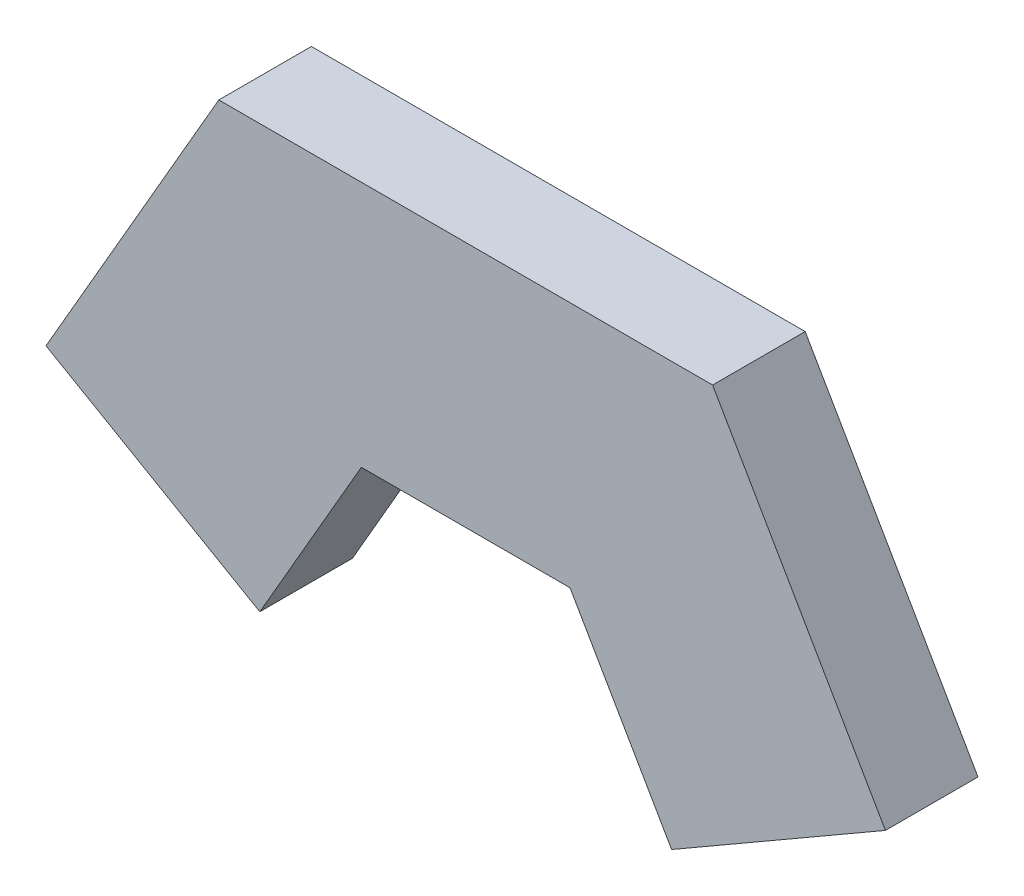
ISO-10303-21;
HEADER;
FILE_DESCRIPTION(('STEP AP214'),'2;1');
FILE_NAME('part.step','',(''),(''),'','','');
FILE_SCHEMA(('AUTOMOTIVE_DESIGN { 1 0 10303 214 1 1 1 1 }'));
ENDSEC;
DATA;
#1=APPLICATION_CONTEXT('core data for automotive mechanical design processes');
#2=APPLICATION_PROTOCOL_DEFINITION('international standard','automotive_design',2000,#1);
#3=PRODUCT_CONTEXT('',#1,'mechanical');
#4=PRODUCT('Part','Part','',(#3));
#5=PRODUCT_RELATED_PRODUCT_CATEGORY('part','',(#4));
#6=PRODUCT_DEFINITION_FORMATION('','',#4);
#7=PRODUCT_DEFINITION_CONTEXT('part definition',#1,'design');
#8=PRODUCT_DEFINITION('design','',#6,#7);
#9=PRODUCT_DEFINITION_SHAPE('','',#8);
#10=(LENGTH_UNIT() NAMED_UNIT(*) SI_UNIT(.MILLI.,.METRE.));
#11=(NAMED_UNIT(*) PLANE_ANGLE_UNIT() SI_UNIT($,.RADIAN.));
#12=(NAMED_UNIT(*) SI_UNIT($,.STERADIAN.) SOLID_ANGLE_UNIT());
#13=UNCERTAINTY_MEASURE_WITH_UNIT(LENGTH_MEASURE(1.E-05),#10,'distance_accuracy_value','');
#14=(GEOMETRIC_REPRESENTATION_CONTEXT(3) GLOBAL_UNCERTAINTY_ASSIGNED_CONTEXT((#13)) GLOBAL_UNIT_ASSIGNED_CONTEXT((#10,
#11,#12)) REPRESENTATION_CONTEXT('',''));
#15=CARTESIAN_POINT('',(0.,0.,0.));
#16=DIRECTION('',(0.,0.,1.));
#17=DIRECTION('',(1.,0.,0.));
#18=AXIS2_PLACEMENT_3D('',#15,#16,#17);
#19=CARTESIAN_POINT('',(-12.065,-20.8971929933185,4.7625));
#20=DIRECTION('',(-0.499999999999999,-0.866025403784439,0.));
#21=DIRECTION('',(0.866025403784439,-0.499999999999999,0.));
#22=AXIS2_PLACEMENT_3D('',#19,#20,#21);
#23=PLANE('',#22);
#24=DIRECTION('',(-0.866025403784439,0.499999999999999,0.));
#25=VECTOR('',#24,1.);
#26=CARTESIAN_POINT('',(-12.065,-20.8971929933185,0.));
#27=LINE('',#26,#25);
#28=CARTESIAN_POINT('',(-10.5914773719375,-21.7479316792873,0.));
#29=VERTEX_POINT('',#28);
#30=CARTESIAN_POINT('',(-21.59,-15.3979316792873,0.));
#31=VERTEX_POINT('',#30);
#32=EDGE_CURVE('E139',#29,#31,#27,.T.);
#33=ORIENTED_EDGE('',*,*,#32,.F.);
#34=DIRECTION('',(0.,0.,-1.));
#35=VECTOR('',#34,1.);
#36=CARTESIAN_POINT('',(-10.5914773719375,-21.7479316792873,4.7625));
#37=LINE('',#36,#35);
#38=CARTESIAN_POINT('',(-10.5914773719375,-21.7479316792873,4.7625));
#39=VERTEX_POINT('',#38);
#40=EDGE_CURVE('E11',#39,#29,#37,.T.);
#41=ORIENTED_EDGE('',*,*,#40,.F.);
#42=DIRECTION('',(-0.866025403784439,0.499999999999999,0.));
#43=VECTOR('',#42,1.);
#44=CARTESIAN_POINT('',(-12.065,-20.8971929933185,4.7625));
#45=LINE('',#44,#43);
#46=CARTESIAN_POINT('',(-21.59,-15.3979316792873,4.7625));
#47=VERTEX_POINT('',#46);
#48=EDGE_CURVE('E167',#39,#47,#45,.T.);
#49=ORIENTED_EDGE('',*,*,#48,.T.);
#50=DIRECTION('',(0.,0.,-1.));
#51=VECTOR('',#50,1.);
#52=CARTESIAN_POINT('',(-21.59,-15.3979316792873,4.7625));
#53=LINE('',#52,#51);
#54=EDGE_CURVE('E58',#47,#31,#53,.T.);
#55=ORIENTED_EDGE('',*,*,#54,.T.);
#56=EDGE_LOOP('',(#33,#41,#49,#55));
#57=FACE_BOUND('',#56,.T.);
#58=ADVANCED_FACE('F41',(#57),#23,.T.);
#59=CARTESIAN_POINT('',(1.47352262806242,-0.850738685968843,4.7625));
#60=DIRECTION('',(0.866025403784439,-0.499999999999999,0.));
#61=DIRECTION('',(0.499999999999999,0.866025403784439,0.));
#62=AXIS2_PLACEMENT_3D('',#59,#60,#61);
#63=PLANE('',#62);
#64=DIRECTION('',(-0.499999999999999,-0.866025403784439,0.));
#65=VECTOR('',#64,1.);
#66=CARTESIAN_POINT('',(1.47352262806242,-0.850738685968843,0.));
#67=LINE('',#66,#65);
#68=CARTESIAN_POINT('',(-5.36765158129166,-12.7,0.));
#69=VERTEX_POINT('',#68);
#70=EDGE_CURVE('E142',#69,#29,#67,.T.);
#71=ORIENTED_EDGE('',*,*,#70,.F.);
#72=DIRECTION('',(0.,0.,-1.));
#73=VECTOR('',#72,1.);
#74=CARTESIAN_POINT('',(-5.36765158129166,-12.7,4.7625));
#75=LINE('',#74,#73);
#76=CARTESIAN_POINT('',(-5.36765158129166,-12.7,4.7625));
#77=VERTEX_POINT('',#76);
#78=EDGE_CURVE('E50',#77,#69,#75,.T.);
#79=ORIENTED_EDGE('',*,*,#78,.F.);
#80=DIRECTION('',(-0.499999999999999,-0.866025403784439,0.));
#81=VECTOR('',#80,1.);
#82=CARTESIAN_POINT('',(1.47352262806242,-0.850738685968843,4.7625));
#83=LINE('',#82,#81);
#84=EDGE_CURVE('E199',#77,#39,#83,.T.);
#85=ORIENTED_EDGE('',*,*,#84,.T.);
#86=ORIENTED_EDGE('',*,*,#40,.T.);
#87=EDGE_LOOP('',(#71,#79,#85,#86));
#88=FACE_BOUND('',#87,.T.);
#89=ADVANCED_FACE('F190',(#88),#63,.T.);
#90=CARTESIAN_POINT('',(0.,-12.7,4.7625));
#91=DIRECTION('',(0.,-1.,0.));
#92=DIRECTION('',(0.,0.,-1.));
#93=AXIS2_PLACEMENT_3D('',#90,#91,#92);
#94=PLANE('',#93);
#95=DIRECTION('',(-1.,0.,0.));
#96=VECTOR('',#95,1.);
#97=CARTESIAN_POINT('',(0.,-12.7,0.));
#98=LINE('',#97,#96);
#99=CARTESIAN_POINT('',(5.36765158129166,-12.7,0.));
#100=VERTEX_POINT('',#99);
#101=EDGE_CURVE('E146',#100,#69,#98,.T.);
#102=ORIENTED_EDGE('',*,*,#101,.F.);
#103=DIRECTION('',(0.,0.,-1.));
#104=VECTOR('',#103,1.);
#105=CARTESIAN_POINT('',(5.36765158129166,-12.7,4.7625));
#106=LINE('',#105,#104);
#107=CARTESIAN_POINT('',(5.36765158129166,-12.7,4.7625));
#108=VERTEX_POINT('',#107);
#109=EDGE_CURVE('E177',#108,#100,#106,.T.);
#110=ORIENTED_EDGE('',*,*,#109,.F.);
#111=DIRECTION('',(-1.,0.,0.));
#112=VECTOR('',#111,1.);
#113=CARTESIAN_POINT('',(0.,-12.7,4.7625));
#114=LINE('',#113,#112);
#115=EDGE_CURVE('E186',#108,#77,#114,.T.);
#116=ORIENTED_EDGE('',*,*,#115,.T.);
#117=ORIENTED_EDGE('',*,*,#78,.T.);
#118=EDGE_LOOP('',(#102,#110,#116,#117));
#119=FACE_BOUND('',#118,.T.);
#120=ADVANCED_FACE('F184',(#119),#94,.T.);
#121=CARTESIAN_POINT('',(-1.47352262806242,-0.850738685968842,4.7625));
#122=DIRECTION('',(-0.866025403784439,-0.499999999999999,0.));
#123=DIRECTION('',(0.499999999999999,-0.866025403784439,0.));
#124=AXIS2_PLACEMENT_3D('',#121,#122,#123);
#125=PLANE('',#124);
#126=DIRECTION('',(-0.499999999999999,0.866025403784439,0.));
#127=VECTOR('',#126,1.);
#128=CARTESIAN_POINT('',(-1.47352262806242,-0.850738685968842,0.));
#129=LINE('',#128,#127);
#130=CARTESIAN_POINT('',(10.5914773719375,-21.7479316792873,0.));
#131=VERTEX_POINT('',#130);
#132=EDGE_CURVE('E150',#131,#100,#129,.T.);
#133=ORIENTED_EDGE('',*,*,#132,.F.);
#134=DIRECTION('',(0.,0.,-1.));
#135=VECTOR('',#134,1.);
#136=CARTESIAN_POINT('',(10.5914773719375,-21.7479316792873,4.7625));
#137=LINE('',#136,#135);
#138=CARTESIAN_POINT('',(10.5914773719375,-21.7479316792873,4.7625));
#139=VERTEX_POINT('',#138);
#140=EDGE_CURVE('E174',#139,#131,#137,.T.);
#141=ORIENTED_EDGE('',*,*,#140,.F.);
#142=DIRECTION('',(-0.499999999999999,0.866025403784439,0.));
#143=VECTOR('',#142,1.);
#144=CARTESIAN_POINT('',(-1.47352262806242,-0.850738685968842,4.7625));
#145=LINE('',#144,#143);
#146=EDGE_CURVE('E198',#139,#108,#145,.T.);
#147=ORIENTED_EDGE('',*,*,#146,.T.);
#148=ORIENTED_EDGE('',*,*,#109,.T.);
#149=EDGE_LOOP('',(#133,#141,#147,#148));
#150=FACE_BOUND('',#149,.T.);
#151=ADVANCED_FACE('F196',(#150),#125,.T.);
#152=CARTESIAN_POINT('',(12.065,-20.8971929933185,4.7625));
#153=DIRECTION('',(0.5,-0.866025403784439,0.));
#154=DIRECTION('',(0.866025403784439,0.5,0.));
#155=AXIS2_PLACEMENT_3D('',#152,#153,#154);
#156=PLANE('',#155);
#157=DIRECTION('',(-0.866025403784439,-0.5,0.));
#158=VECTOR('',#157,1.);
#159=CARTESIAN_POINT('',(12.065,-20.8971929933185,0.));
#160=LINE('',#159,#158);
#161=CARTESIAN_POINT('',(21.59,-15.3979316792873,0.));
#162=VERTEX_POINT('',#161);
#163=EDGE_CURVE('E154',#162,#131,#160,.T.);
#164=ORIENTED_EDGE('',*,*,#163,.F.);
#165=DIRECTION('',(0.,0.,-1.));
#166=VECTOR('',#165,1.);
#167=CARTESIAN_POINT('',(21.59,-15.3979316792873,4.7625));
#168=LINE('',#167,#166);
#169=CARTESIAN_POINT('',(21.59,-15.3979316792873,4.7625));
#170=VERTEX_POINT('',#169);
#171=EDGE_CURVE('E118',#170,#162,#168,.T.);
#172=ORIENTED_EDGE('',*,*,#171,.F.);
#173=DIRECTION('',(-0.866025403784439,-0.5,0.));
#174=VECTOR('',#173,1.);
#175=CARTESIAN_POINT('',(12.065,-20.8971929933185,4.7625));
#176=LINE('',#175,#174);
#177=EDGE_CURVE('E128',#170,#139,#176,.T.);
#178=ORIENTED_EDGE('',*,*,#177,.T.);
#179=ORIENTED_EDGE('',*,*,#140,.T.);
#180=EDGE_LOOP('',(#164,#172,#178,#179));
#181=FACE_BOUND('',#180,.T.);
#182=ADVANCED_FACE('F209',(#181),#156,.T.);
#183=CARTESIAN_POINT('',(9.52500000000001,5.49926131403118,4.7625));
#184=DIRECTION('',(0.866025403784439,0.499999999999999,0.));
#185=DIRECTION('',(-0.499999999999999,0.866025403784439,0.));
#186=AXIS2_PLACEMENT_3D('',#183,#184,#185);
#187=PLANE('',#186);
#188=DIRECTION('',(0.499999999999999,-0.866025403784439,0.));
#189=VECTOR('',#188,1.);
#190=CARTESIAN_POINT('',(9.52500000000001,5.49926131403118,0.));
#191=LINE('',#190,#189);
#192=CARTESIAN_POINT('',(12.7,0.,0.));
#193=VERTEX_POINT('',#192);
#194=EDGE_CURVE('E113',#193,#162,#191,.T.);
#195=ORIENTED_EDGE('',*,*,#194,.F.);
#196=DIRECTION('',(0.,0.,-1.));
#197=VECTOR('',#196,1.);
#198=CARTESIAN_POINT('',(12.7,0.,4.7625));
#199=LINE('',#198,#197);
#200=CARTESIAN_POINT('',(12.7,0.,4.7625));
#201=VERTEX_POINT('',#200);
#202=EDGE_CURVE('E108',#201,#193,#199,.T.);
#203=ORIENTED_EDGE('',*,*,#202,.F.);
#204=DIRECTION('',(0.499999999999999,-0.866025403784439,0.));
#205=VECTOR('',#204,1.);
#206=CARTESIAN_POINT('',(9.52500000000001,5.49926131403118,4.7625));
#207=LINE('',#206,#205);
#208=EDGE_CURVE('E111',#201,#170,#207,.T.);
#209=ORIENTED_EDGE('',*,*,#208,.T.);
#210=ORIENTED_EDGE('',*,*,#171,.T.);
#211=EDGE_LOOP('',(#195,#203,#209,#210));
#212=FACE_BOUND('',#211,.T.);
#213=ADVANCED_FACE('F110',(#212),#187,.T.);
#214=CARTESIAN_POINT('',(0.,0.,4.7625));
#215=DIRECTION('',(0.,1.,0.));
#216=DIRECTION('',(0.,0.,1.));
#217=AXIS2_PLACEMENT_3D('',#214,#215,#216);
#218=PLANE('',#217);
#219=DIRECTION('',(1.,0.,0.));
#220=VECTOR('',#219,1.);
#221=CARTESIAN_POINT('',(0.,0.,0.));
#222=LINE('',#221,#220);
#223=CARTESIAN_POINT('',(-12.7,0.,0.));
#224=VERTEX_POINT('',#223);
#225=EDGE_CURVE('E160',#224,#193,#222,.T.);
#226=ORIENTED_EDGE('',*,*,#225,.F.);
#227=DIRECTION('',(0.,0.,-1.));
#228=VECTOR('',#227,1.);
#229=CARTESIAN_POINT('',(-12.7,0.,4.7625));
#230=LINE('',#229,#228);
#231=CARTESIAN_POINT('',(-12.7,0.,4.7625));
#232=VERTEX_POINT('',#231);
#233=EDGE_CURVE('E83',#232,#224,#230,.T.);
#234=ORIENTED_EDGE('',*,*,#233,.F.);
#235=DIRECTION('',(1.,0.,0.));
#236=VECTOR('',#235,1.);
#237=CARTESIAN_POINT('',(0.,0.,4.7625));
#238=LINE('',#237,#236);
#239=EDGE_CURVE('E125',#232,#201,#238,.T.);
#240=ORIENTED_EDGE('',*,*,#239,.T.);
#241=ORIENTED_EDGE('',*,*,#202,.T.);
#242=EDGE_LOOP('',(#226,#234,#240,#241));
#243=FACE_BOUND('',#242,.T.);
#244=ADVANCED_FACE('F131',(#243),#218,.T.);
#245=CARTESIAN_POINT('',(-9.52500000000001,5.49926131403118,4.7625));
#246=DIRECTION('',(-0.866025403784439,0.499999999999999,0.));
#247=DIRECTION('',(-0.499999999999999,-0.866025403784439,0.));
#248=AXIS2_PLACEMENT_3D('',#245,#246,#247);
#249=PLANE('',#248);
#250=DIRECTION('',(0.499999999999999,0.866025403784439,0.));
#251=VECTOR('',#250,1.);
#252=CARTESIAN_POINT('',(-9.52500000000001,5.49926131403118,0.));
#253=LINE('',#252,#251);
#254=EDGE_CURVE('E163',#31,#224,#253,.T.);
#255=ORIENTED_EDGE('',*,*,#254,.F.);
#256=ORIENTED_EDGE('',*,*,#54,.F.);
#257=DIRECTION('',(0.499999999999999,0.866025403784439,0.));
#258=VECTOR('',#257,1.);
#259=CARTESIAN_POINT('',(-9.52500000000001,5.49926131403118,4.7625));
#260=LINE('',#259,#258);
#261=EDGE_CURVE('E133',#47,#232,#260,.T.);
#262=ORIENTED_EDGE('',*,*,#261,.T.);
#263=ORIENTED_EDGE('',*,*,#233,.T.);
#264=EDGE_LOOP('',(#255,#256,#262,#263));
#265=FACE_BOUND('',#264,.T.);
#266=ADVANCED_FACE('F210',(#265),#249,.T.);
#267=CARTESIAN_POINT('',(0.,0.,4.7625));
#268=DIRECTION('',(0.,0.,1.));
#269=DIRECTION('',(1.,0.,0.));
#270=AXIS2_PLACEMENT_3D('',#267,#268,#269);
#271=PLANE('',#270);
#272=ORIENTED_EDGE('',*,*,#48,.F.);
#273=ORIENTED_EDGE('',*,*,#84,.F.);
#274=ORIENTED_EDGE('',*,*,#115,.F.);
#275=ORIENTED_EDGE('',*,*,#146,.F.);
#276=ORIENTED_EDGE('',*,*,#177,.F.);
#277=ORIENTED_EDGE('',*,*,#208,.F.);
#278=ORIENTED_EDGE('',*,*,#239,.F.);
#279=ORIENTED_EDGE('',*,*,#261,.F.);
#280=EDGE_LOOP('',(#272,#273,#274,#275,#276,#277,#278,#279));
#281=FACE_BOUND('',#280,.T.);
#282=ADVANCED_FACE('F123',(#281),#271,.T.);
#283=CARTESIAN_POINT('',(0.,0.,0.));
#284=DIRECTION('',(0.,0.,1.));
#285=DIRECTION('',(1.,0.,0.));
#286=AXIS2_PLACEMENT_3D('',#283,#284,#285);
#287=PLANE('',#286);
#288=ORIENTED_EDGE('',*,*,#32,.T.);
#289=ORIENTED_EDGE('',*,*,#254,.T.);
#290=ORIENTED_EDGE('',*,*,#225,.T.);
#291=ORIENTED_EDGE('',*,*,#194,.T.);
#292=ORIENTED_EDGE('',*,*,#163,.T.);
#293=ORIENTED_EDGE('',*,*,#132,.T.);
#294=ORIENTED_EDGE('',*,*,#101,.T.);
#295=ORIENTED_EDGE('',*,*,#70,.T.);
#296=EDGE_LOOP('',(#288,#289,#290,#291,#292,#293,#294,#295));
#297=FACE_BOUND('',#296,.T.);
#298=ADVANCED_FACE('F192',(#297),#287,.F.);
#299=CLOSED_SHELL('',(#58,#89,#120,#151,#182,#213,#244,#266,#282,#298));
#300=MANIFOLD_SOLID_BREP('B2',#299);
#301=ADVANCED_BREP_SHAPE_REPRESENTATION('',(#18,#300),#14);
#302=SHAPE_DEFINITION_REPRESENTATION(#9,#301);
ENDSEC;
END-ISO-10303-21;
